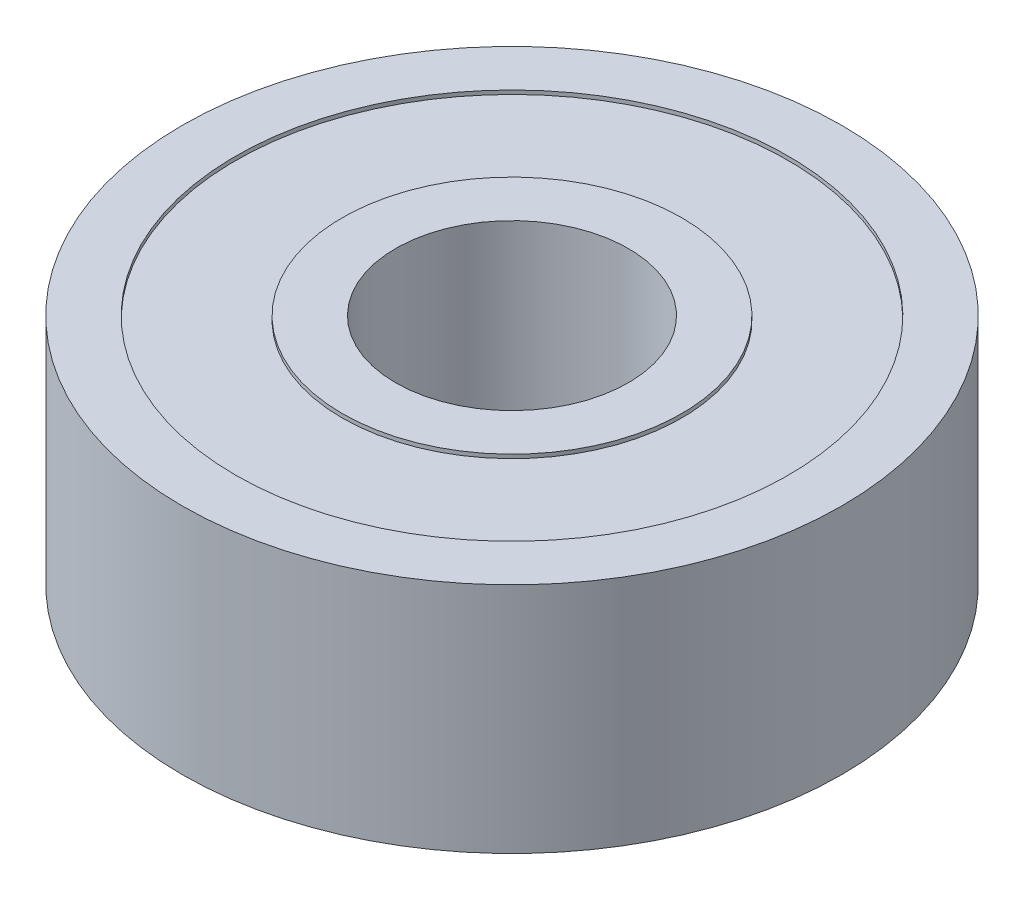
ISO-10303-21;
HEADER;
FILE_DESCRIPTION(('STEP AP214'),'2;1');
FILE_NAME('part.step','',(''),(''),'','','');
FILE_SCHEMA(('AUTOMOTIVE_DESIGN { 1 0 10303 214 1 1 1 1 }'));
ENDSEC;
DATA;
#1=APPLICATION_CONTEXT('core data for automotive mechanical design processes');
#2=APPLICATION_PROTOCOL_DEFINITION('international standard','automotive_design',2000,#1);
#3=PRODUCT_CONTEXT('',#1,'mechanical');
#4=PRODUCT('Part','Part','',(#3));
#5=PRODUCT_RELATED_PRODUCT_CATEGORY('part','',(#4));
#6=PRODUCT_DEFINITION_FORMATION('','',#4);
#7=PRODUCT_DEFINITION_CONTEXT('part definition',#1,'design');
#8=PRODUCT_DEFINITION('design','',#6,#7);
#9=PRODUCT_DEFINITION_SHAPE('','',#8);
#10=(LENGTH_UNIT() NAMED_UNIT(*) SI_UNIT(.MILLI.,.METRE.));
#11=(NAMED_UNIT(*) PLANE_ANGLE_UNIT() SI_UNIT($,.RADIAN.));
#12=(NAMED_UNIT(*) SI_UNIT($,.STERADIAN.) SOLID_ANGLE_UNIT());
#13=UNCERTAINTY_MEASURE_WITH_UNIT(LENGTH_MEASURE(1.E-05),#10,'distance_accuracy_value','');
#14=(GEOMETRIC_REPRESENTATION_CONTEXT(3) GLOBAL_UNCERTAINTY_ASSIGNED_CONTEXT((#13)) GLOBAL_UNIT_ASSIGNED_CONTEXT((#10,
#11,#12)) REPRESENTATION_CONTEXT('',''));
#15=CARTESIAN_POINT('',(0.,0.,0.));
#16=DIRECTION('',(0.,0.,1.));
#17=DIRECTION('',(1.,0.,0.));
#18=AXIS2_PLACEMENT_3D('',#15,#16,#17);
#19=CARTESIAN_POINT('',(0.,0.,0.));
#20=DIRECTION('',(0.,1.,0.));
#21=DIRECTION('',(0.,0.,1.));
#22=AXIS2_PLACEMENT_3D('',#19,#20,#21);
#23=PLANE('',#22);
#24=CARTESIAN_POINT('',(0.,0.,0.));
#25=DIRECTION('',(0.,1.,0.));
#26=DIRECTION('',(0.,0.,1.));
#27=AXIS2_PLACEMENT_3D('',#24,#25,#26);
#28=CIRCLE('',#27,3.);
#29=CARTESIAN_POINT('',(0.,0.,3.));
#30=VERTEX_POINT('',#29);
#31=EDGE_CURVE('E46',#30,#30,#28,.T.);
#32=ORIENTED_EDGE('',*,*,#31,.T.);
#33=EDGE_LOOP('',(#32));
#34=FACE_BOUND('',#33,.T.);
#35=CARTESIAN_POINT('',(0.,0.,0.));
#36=DIRECTION('',(0.,-1.,0.));
#37=DIRECTION('',(0.,0.,-1.));
#38=AXIS2_PLACEMENT_3D('',#35,#36,#37);
#39=CIRCLE('',#38,4.375);
#40=CARTESIAN_POINT('',(0.,0.,-4.375));
#41=VERTEX_POINT('',#40);
#42=EDGE_CURVE('E70',#41,#41,#39,.T.);
#43=ORIENTED_EDGE('',*,*,#42,.T.);
#44=EDGE_LOOP('',(#43));
#45=FACE_BOUND('',#44,.T.);
#46=ADVANCED_FACE('F33',(#34,#45),#23,.F.);
#47=CARTESIAN_POINT('',(0.,6.,0.));
#48=DIRECTION('',(0.,1.,0.));
#49=DIRECTION('',(0.,0.,1.));
#50=AXIS2_PLACEMENT_3D('',#47,#48,#49);
#51=PLANE('',#50);
#52=CARTESIAN_POINT('',(0.,6.,0.));
#53=DIRECTION('',(0.,1.,0.));
#54=DIRECTION('',(0.,0.,1.));
#55=AXIS2_PLACEMENT_3D('',#52,#53,#54);
#56=CIRCLE('',#55,3.);
#57=CARTESIAN_POINT('',(0.,6.,3.));
#58=VERTEX_POINT('',#57);
#59=EDGE_CURVE('E44',#58,#58,#56,.T.);
#60=ORIENTED_EDGE('',*,*,#59,.F.);
#61=EDGE_LOOP('',(#60));
#62=FACE_BOUND('',#61,.T.);
#63=CARTESIAN_POINT('',(0.,6.,0.));
#64=DIRECTION('',(0.,1.,0.));
#65=DIRECTION('',(0.,0.,1.));
#66=AXIS2_PLACEMENT_3D('',#63,#64,#65);
#67=CIRCLE('',#66,4.375);
#68=CARTESIAN_POINT('',(0.,6.,4.375));
#69=VERTEX_POINT('',#68);
#70=EDGE_CURVE('E58',#69,#69,#67,.T.);
#71=ORIENTED_EDGE('',*,*,#70,.T.);
#72=EDGE_LOOP('',(#71));
#73=FACE_BOUND('',#72,.T.);
#74=ADVANCED_FACE('F108',(#62,#73),#51,.T.);
#75=CARTESIAN_POINT('',(0.,6.,0.));
#76=DIRECTION('',(0.,1.,0.));
#77=DIRECTION('',(0.,0.,1.));
#78=AXIS2_PLACEMENT_3D('',#75,#76,#77);
#79=CIRCLE('',#78,7.125);
#80=CARTESIAN_POINT('',(0.,6.,7.125));
#81=VERTEX_POINT('',#80);
#82=EDGE_CURVE('E52',#81,#81,#79,.T.);
#83=ORIENTED_EDGE('',*,*,#82,.F.);
#84=EDGE_LOOP('',(#83));
#85=FACE_BOUND('',#84,.T.);
#86=CARTESIAN_POINT('',(0.,6.,0.));
#87=DIRECTION('',(0.,1.,0.));
#88=DIRECTION('',(0.,0.,1.));
#89=AXIS2_PLACEMENT_3D('',#86,#87,#88);
#90=CIRCLE('',#89,8.5);
#91=CARTESIAN_POINT('',(0.,6.,8.5));
#92=VERTEX_POINT('',#91);
#93=EDGE_CURVE('E10',#92,#92,#90,.T.);
#94=ORIENTED_EDGE('',*,*,#93,.T.);
#95=EDGE_LOOP('',(#94));
#96=FACE_BOUND('',#95,.T.);
#97=ADVANCED_FACE('F95',(#85,#96),#51,.T.);
#98=CARTESIAN_POINT('',(0.,0.,0.));
#99=DIRECTION('',(0.,-1.,0.));
#100=DIRECTION('',(0.,0.,-1.));
#101=AXIS2_PLACEMENT_3D('',#98,#99,#100);
#102=CIRCLE('',#101,7.125);
#103=CARTESIAN_POINT('',(0.,0.,-7.125));
#104=VERTEX_POINT('',#103);
#105=EDGE_CURVE('E64',#104,#104,#102,.T.);
#106=ORIENTED_EDGE('',*,*,#105,.F.);
#107=EDGE_LOOP('',(#106));
#108=FACE_BOUND('',#107,.T.);
#109=CARTESIAN_POINT('',(0.,0.,0.));
#110=DIRECTION('',(0.,1.,0.));
#111=DIRECTION('',(0.,0.,1.));
#112=AXIS2_PLACEMENT_3D('',#109,#110,#111);
#113=CIRCLE('',#112,8.5);
#114=CARTESIAN_POINT('',(0.,0.,8.5));
#115=VERTEX_POINT('',#114);
#116=EDGE_CURVE('E37',#115,#115,#113,.T.);
#117=ORIENTED_EDGE('',*,*,#116,.F.);
#118=EDGE_LOOP('',(#117));
#119=FACE_BOUND('',#118,.T.);
#120=ADVANCED_FACE('F92',(#108,#119),#23,.F.);
#121=CARTESIAN_POINT('',(0.,6.,0.));
#122=DIRECTION('',(0.,-1.,0.));
#123=DIRECTION('',(0.,0.,-1.));
#124=AXIS2_PLACEMENT_3D('',#121,#122,#123);
#125=CYLINDRICAL_SURFACE('',#124,8.5);
#126=ORIENTED_EDGE('',*,*,#93,.F.);
#127=EDGE_LOOP('',(#126));
#128=FACE_BOUND('',#127,.T.);
#129=ORIENTED_EDGE('',*,*,#116,.T.);
#130=EDGE_LOOP('',(#129));
#131=FACE_BOUND('',#130,.T.);
#132=ADVANCED_FACE('F35',(#128,#131),#125,.T.);
#133=CARTESIAN_POINT('',(0.,6.,0.));
#134=DIRECTION('',(0.,-1.,0.));
#135=DIRECTION('',(0.,0.,-1.));
#136=AXIS2_PLACEMENT_3D('',#133,#134,#135);
#137=CYLINDRICAL_SURFACE('',#136,3.);
#138=ORIENTED_EDGE('',*,*,#59,.T.);
#139=EDGE_LOOP('',(#138));
#140=FACE_BOUND('',#139,.T.);
#141=ORIENTED_EDGE('',*,*,#31,.F.);
#142=EDGE_LOOP('',(#141));
#143=FACE_BOUND('',#142,.T.);
#144=ADVANCED_FACE('F99',(#140,#143),#137,.F.);
#145=CARTESIAN_POINT('',(0.,5.9,0.));
#146=DIRECTION('',(0.,1.,0.));
#147=DIRECTION('',(0.,0.,1.));
#148=AXIS2_PLACEMENT_3D('',#145,#146,#147);
#149=CYLINDRICAL_SURFACE('',#148,7.125);
#150=CARTESIAN_POINT('',(0.,5.9,0.));
#151=DIRECTION('',(0.,1.,0.));
#152=DIRECTION('',(0.,0.,1.));
#153=AXIS2_PLACEMENT_3D('',#150,#151,#152);
#154=CIRCLE('',#153,7.125);
#155=CARTESIAN_POINT('',(0.,5.9,7.125));
#156=VERTEX_POINT('',#155);
#157=EDGE_CURVE('E49',#156,#156,#154,.T.);
#158=ORIENTED_EDGE('',*,*,#157,.F.);
#159=EDGE_LOOP('',(#158));
#160=FACE_BOUND('',#159,.T.);
#161=ORIENTED_EDGE('',*,*,#82,.T.);
#162=EDGE_LOOP('',(#161));
#163=FACE_BOUND('',#162,.T.);
#164=ADVANCED_FACE('F104',(#160,#163),#149,.F.);
#165=CARTESIAN_POINT('',(0.,5.9,0.));
#166=DIRECTION('',(0.,1.,0.));
#167=DIRECTION('',(0.,0.,1.));
#168=AXIS2_PLACEMENT_3D('',#165,#166,#167);
#169=PLANE('',#168);
#170=CARTESIAN_POINT('',(0.,5.9,0.));
#171=DIRECTION('',(0.,1.,0.));
#172=DIRECTION('',(0.,0.,1.));
#173=AXIS2_PLACEMENT_3D('',#170,#171,#172);
#174=CIRCLE('',#173,4.375);
#175=CARTESIAN_POINT('',(0.,5.9,4.375));
#176=VERTEX_POINT('',#175);
#177=EDGE_CURVE('E55',#176,#176,#174,.T.);
#178=ORIENTED_EDGE('',*,*,#177,.F.);
#179=EDGE_LOOP('',(#178));
#180=FACE_BOUND('',#179,.T.);
#181=ORIENTED_EDGE('',*,*,#157,.T.);
#182=EDGE_LOOP('',(#181));
#183=FACE_BOUND('',#182,.T.);
#184=ADVANCED_FACE('F121',(#180,#183),#169,.T.);
#185=CARTESIAN_POINT('',(0.,5.9,0.));
#186=DIRECTION('',(0.,1.,0.));
#187=DIRECTION('',(0.,0.,1.));
#188=AXIS2_PLACEMENT_3D('',#185,#186,#187);
#189=CYLINDRICAL_SURFACE('',#188,4.375);
#190=ORIENTED_EDGE('',*,*,#177,.T.);
#191=EDGE_LOOP('',(#190));
#192=FACE_BOUND('',#191,.T.);
#193=ORIENTED_EDGE('',*,*,#70,.F.);
#194=EDGE_LOOP('',(#193));
#195=FACE_BOUND('',#194,.T.);
#196=ADVANCED_FACE('F88',(#192,#195),#189,.T.);
#197=CARTESIAN_POINT('',(0.,0.1,0.));
#198=DIRECTION('',(0.,-1.,0.));
#199=DIRECTION('',(0.,0.,-1.));
#200=AXIS2_PLACEMENT_3D('',#197,#198,#199);
#201=CYLINDRICAL_SURFACE('',#200,7.125);
#202=CARTESIAN_POINT('',(0.,0.1,0.));
#203=DIRECTION('',(0.,-1.,0.));
#204=DIRECTION('',(0.,0.,-1.));
#205=AXIS2_PLACEMENT_3D('',#202,#203,#204);
#206=CIRCLE('',#205,7.125);
#207=CARTESIAN_POINT('',(0.,0.1,-7.125));
#208=VERTEX_POINT('',#207);
#209=EDGE_CURVE('E61',#208,#208,#206,.T.);
#210=ORIENTED_EDGE('',*,*,#209,.F.);
#211=EDGE_LOOP('',(#210));
#212=FACE_BOUND('',#211,.T.);
#213=ORIENTED_EDGE('',*,*,#105,.T.);
#214=EDGE_LOOP('',(#213));
#215=FACE_BOUND('',#214,.T.);
#216=ADVANCED_FACE('F82',(#212,#215),#201,.F.);
#217=CARTESIAN_POINT('',(0.,0.1,0.));
#218=DIRECTION('',(0.,-1.,0.));
#219=DIRECTION('',(0.,0.,-1.));
#220=AXIS2_PLACEMENT_3D('',#217,#218,#219);
#221=PLANE('',#220);
#222=CARTESIAN_POINT('',(0.,0.1,0.));
#223=DIRECTION('',(0.,-1.,0.));
#224=DIRECTION('',(0.,0.,-1.));
#225=AXIS2_PLACEMENT_3D('',#222,#223,#224);
#226=CIRCLE('',#225,4.375);
#227=CARTESIAN_POINT('',(0.,0.1,-4.375));
#228=VERTEX_POINT('',#227);
#229=EDGE_CURVE('E67',#228,#228,#226,.T.);
#230=ORIENTED_EDGE('',*,*,#229,.F.);
#231=EDGE_LOOP('',(#230));
#232=FACE_BOUND('',#231,.T.);
#233=ORIENTED_EDGE('',*,*,#209,.T.);
#234=EDGE_LOOP('',(#233));
#235=FACE_BOUND('',#234,.T.);
#236=ADVANCED_FACE('F79',(#232,#235),#221,.T.);
#237=CARTESIAN_POINT('',(0.,0.1,0.));
#238=DIRECTION('',(0.,-1.,0.));
#239=DIRECTION('',(0.,0.,-1.));
#240=AXIS2_PLACEMENT_3D('',#237,#238,#239);
#241=CYLINDRICAL_SURFACE('',#240,4.375);
#242=ORIENTED_EDGE('',*,*,#229,.T.);
#243=EDGE_LOOP('',(#242));
#244=FACE_BOUND('',#243,.T.);
#245=ORIENTED_EDGE('',*,*,#42,.F.);
#246=EDGE_LOOP('',(#245));
#247=FACE_BOUND('',#246,.T.);
#248=ADVANCED_FACE('F76',(#244,#247),#241,.T.);
#249=CLOSED_SHELL('',(#46,#74,#97,#120,#132,#144,#164,#184,#196,#216,#236,#248));
#250=MANIFOLD_SOLID_BREP('B2',#249);
#251=ADVANCED_BREP_SHAPE_REPRESENTATION('',(#18,#250),#14);
#252=SHAPE_DEFINITION_REPRESENTATION(#9,#251);
ENDSEC;
END-ISO-10303-21;
